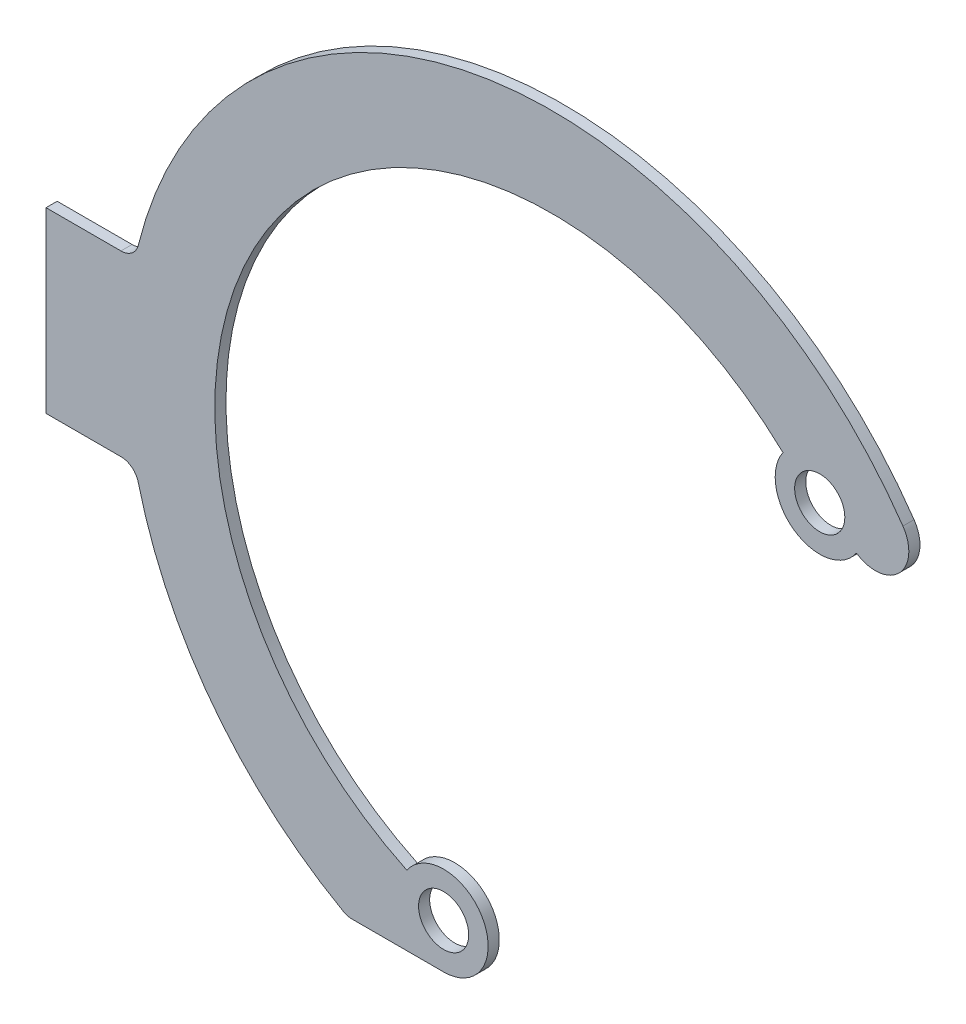
ISO-10303-21;
HEADER;
FILE_DESCRIPTION(('STEP AP214'),'2;1');
FILE_NAME('part.step','',(''),(''),'','','');
FILE_SCHEMA(('AUTOMOTIVE_DESIGN { 1 0 10303 214 1 1 1 1 }'));
ENDSEC;
DATA;
#1=APPLICATION_CONTEXT('core data for automotive mechanical design processes');
#2=APPLICATION_PROTOCOL_DEFINITION('international standard','automotive_design',2000,#1);
#3=PRODUCT_CONTEXT('',#1,'mechanical');
#4=PRODUCT('Part','Part','',(#3));
#5=PRODUCT_RELATED_PRODUCT_CATEGORY('part','',(#4));
#6=PRODUCT_DEFINITION_FORMATION('','',#4);
#7=PRODUCT_DEFINITION_CONTEXT('part definition',#1,'design');
#8=PRODUCT_DEFINITION('design','',#6,#7);
#9=PRODUCT_DEFINITION_SHAPE('','',#8);
#10=(LENGTH_UNIT() NAMED_UNIT(*) SI_UNIT(.MILLI.,.METRE.));
#11=(NAMED_UNIT(*) PLANE_ANGLE_UNIT() SI_UNIT($,.RADIAN.));
#12=(NAMED_UNIT(*) SI_UNIT($,.STERADIAN.) SOLID_ANGLE_UNIT());
#13=UNCERTAINTY_MEASURE_WITH_UNIT(LENGTH_MEASURE(1.E-05),#10,'distance_accuracy_value','');
#14=(GEOMETRIC_REPRESENTATION_CONTEXT(3) GLOBAL_UNCERTAINTY_ASSIGNED_CONTEXT((#13)) GLOBAL_UNIT_ASSIGNED_CONTEXT((#10,
#11,#12)) REPRESENTATION_CONTEXT('',''));
#15=CARTESIAN_POINT('',(0.,0.,0.));
#16=DIRECTION('',(0.,0.,1.));
#17=DIRECTION('',(1.,0.,0.));
#18=AXIS2_PLACEMENT_3D('',#15,#16,#17);
#19=CARTESIAN_POINT('',(0.,-25.4,6.35));
#20=DIRECTION('',(0.,-1.,0.));
#21=DIRECTION('',(1.,0.,0.));
#22=AXIS2_PLACEMENT_3D('',#19,#20,#21);
#23=PLANE('',#22);
#24=DIRECTION('',(-1.,0.,0.));
#25=VECTOR('',#24,1.);
#26=CARTESIAN_POINT('',(0.,-25.4,6.35));
#27=LINE('',#26,#25);
#28=CARTESIAN_POINT('',(0.,-25.4,6.35));
#29=VERTEX_POINT('',#28);
#30=CARTESIAN_POINT('',(-52.1627829426318,-25.4,6.35));
#31=VERTEX_POINT('',#30);
#32=EDGE_CURVE('E135',#29,#31,#27,.T.);
#33=ORIENTED_EDGE('',*,*,#32,.T.);
#34=DIRECTION('',(0.,0.,1.));
#35=VECTOR('',#34,1.);
#36=CARTESIAN_POINT('',(-52.1627829426318,-25.4,0.));
#37=LINE('',#36,#35);
#38=CARTESIAN_POINT('',(-52.1627829426318,-25.4,0.));
#39=VERTEX_POINT('',#38);
#40=EDGE_CURVE('E143',#31,#39,#37,.F.);
#41=ORIENTED_EDGE('',*,*,#40,.T.);
#42=DIRECTION('',(-1.,0.,0.));
#43=VECTOR('',#42,1.);
#44=CARTESIAN_POINT('',(0.,-25.4,0.));
#45=LINE('',#44,#43);
#46=CARTESIAN_POINT('',(0.,-25.4,0.));
#47=VERTEX_POINT('',#46);
#48=EDGE_CURVE('E138',#47,#39,#45,.T.);
#49=ORIENTED_EDGE('',*,*,#48,.F.);
#50=DIRECTION('',(0.,0.,-1.));
#51=VECTOR('',#50,1.);
#52=CARTESIAN_POINT('',(0.,-25.4,6.35));
#53=LINE('',#52,#51);
#54=EDGE_CURVE('E132',#29,#47,#53,.T.);
#55=ORIENTED_EDGE('',*,*,#54,.F.);
#56=EDGE_LOOP('',(#33,#41,#49,#55));
#57=FACE_BOUND('',#56,.T.);
#58=ADVANCED_FACE('F35',(#57),#23,.T.);
#59=CARTESIAN_POINT('',(0.,0.,6.35));
#60=DIRECTION('',(0.,0.,-1.));
#61=DIRECTION('',(-1.,0.,0.));
#62=AXIS2_PLACEMENT_3D('',#59,#60,#61);
#63=CYLINDRICAL_SURFACE('',#62,25.4);
#64=CARTESIAN_POINT('',(0.,0.,0.));
#65=DIRECTION('',(0.,0.,1.));
#66=DIRECTION('',(1.,0.,0.));
#67=AXIS2_PLACEMENT_3D('',#64,#65,#66);
#68=CIRCLE('',#67,25.4);
#69=CARTESIAN_POINT('',(-20.9641804602874,14.340960136215,0.));
#70=VERTEX_POINT('',#69);
#71=EDGE_CURVE('E182',#70,#47,#68,.F.);
#72=ORIENTED_EDGE('',*,*,#71,.F.);
#73=DIRECTION('',(0.,0.,-1.));
#74=VECTOR('',#73,1.);
#75=CARTESIAN_POINT('',(-20.9641804602874,14.340960136215,6.35));
#76=LINE('',#75,#74);
#77=CARTESIAN_POINT('',(-20.9641804602874,14.340960136215,6.35));
#78=VERTEX_POINT('',#77);
#79=EDGE_CURVE('E144',#78,#70,#76,.T.);
#80=ORIENTED_EDGE('',*,*,#79,.F.);
#81=CARTESIAN_POINT('',(0.,0.,6.35));
#82=DIRECTION('',(0.,0.,1.));
#83=DIRECTION('',(1.,0.,0.));
#84=AXIS2_PLACEMENT_3D('',#81,#82,#83);
#85=CIRCLE('',#84,25.4);
#86=EDGE_CURVE('E150',#78,#29,#85,.F.);
#87=ORIENTED_EDGE('',*,*,#86,.T.);
#88=ORIENTED_EDGE('',*,*,#54,.T.);
#89=EDGE_LOOP('',(#72,#80,#87,#88));
#90=FACE_BOUND('',#89,.T.);
#91=ADVANCED_FACE('F155',(#90),#63,.T.);
#92=CARTESIAN_POINT('',(61.7615299678129,187.852179878327,6.35));
#93=DIRECTION('',(0.,0.,-1.));
#94=DIRECTION('',(-1.,0.,0.));
#95=AXIS2_PLACEMENT_3D('',#92,#93,#94);
#96=CYLINDRICAL_SURFACE('',#95,192.22301251991);
#97=CARTESIAN_POINT('',(61.7615299678129,187.852179878327,0.));
#98=DIRECTION('',(0.,0.,1.));
#99=DIRECTION('',(1.,0.,0.));
#100=AXIS2_PLACEMENT_3D('',#97,#98,#99);
#101=CIRCLE('',#100,192.22301251991);
#102=CARTESIAN_POINT('',(193.49166298277,327.840960136215,0.));
#103=VERTEX_POINT('',#102);
#104=EDGE_CURVE('E184',#70,#103,#101,.F.);
#105=ORIENTED_EDGE('',*,*,#104,.T.);
#106=DIRECTION('',(0.,0.,-1.));
#107=VECTOR('',#106,1.);
#108=CARTESIAN_POINT('',(193.49166298277,327.840960136215,6.35));
#109=LINE('',#108,#107);
#110=CARTESIAN_POINT('',(193.49166298277,327.840960136215,6.35));
#111=VERTEX_POINT('',#110);
#112=EDGE_CURVE('E216',#111,#103,#109,.T.);
#113=ORIENTED_EDGE('',*,*,#112,.F.);
#114=CARTESIAN_POINT('',(61.7615299678129,187.852179878327,6.35));
#115=DIRECTION('',(0.,0.,1.));
#116=DIRECTION('',(1.,0.,0.));
#117=AXIS2_PLACEMENT_3D('',#114,#115,#116);
#118=CIRCLE('',#117,192.22301251991);
#119=EDGE_CURVE('E157',#78,#111,#118,.F.);
#120=ORIENTED_EDGE('',*,*,#119,.F.);
#121=ORIENTED_EDGE('',*,*,#79,.T.);
#122=EDGE_LOOP('',(#105,#113,#120,#121));
#123=FACE_BOUND('',#122,.T.);
#124=ADVANCED_FACE('F278',(#123),#96,.F.);
#125=CARTESIAN_POINT('',(214.455843443057,313.5,6.35));
#126=DIRECTION('',(0.,0.,-1.));
#127=DIRECTION('',(-1.,0.,0.));
#128=AXIS2_PLACEMENT_3D('',#125,#126,#127);
#129=CYLINDRICAL_SURFACE('',#128,25.4);
#130=CARTESIAN_POINT('',(214.455843443057,313.5,0.));
#131=DIRECTION('',(0.,0.,1.));
#132=DIRECTION('',(1.,0.,0.));
#133=AXIS2_PLACEMENT_3D('',#130,#131,#132);
#134=CIRCLE('',#133,25.4);
#135=CARTESIAN_POINT('',(235.420023903345,299.159039863785,0.));
#136=VERTEX_POINT('',#135);
#137=EDGE_CURVE('E186',#103,#136,#134,.T.);
#138=ORIENTED_EDGE('',*,*,#137,.T.);
#139=DIRECTION('',(0.,0.,-1.));
#140=VECTOR('',#139,1.);
#141=CARTESIAN_POINT('',(235.420023903345,299.159039863785,6.35));
#142=LINE('',#141,#140);
#143=CARTESIAN_POINT('',(235.420023903345,299.159039863785,6.35));
#144=VERTEX_POINT('',#143);
#145=EDGE_CURVE('E213',#144,#136,#142,.T.);
#146=ORIENTED_EDGE('',*,*,#145,.F.);
#147=CARTESIAN_POINT('',(214.455843443057,313.5,6.35));
#148=DIRECTION('',(0.,0.,1.));
#149=DIRECTION('',(1.,0.,0.));
#150=AXIS2_PLACEMENT_3D('',#147,#148,#149);
#151=CIRCLE('',#150,25.4);
#152=EDGE_CURVE('E159',#111,#144,#151,.T.);
#153=ORIENTED_EDGE('',*,*,#152,.F.);
#154=ORIENTED_EDGE('',*,*,#112,.T.);
#155=EDGE_LOOP('',(#138,#146,#153,#154));
#156=FACE_BOUND('',#155,.T.);
#157=ADVANCED_FACE('F303',(#156),#129,.T.);
#158=CARTESIAN_POINT('',(246.187929872378,314.899988989232,6.35));
#159=DIRECTION('',(0.,0.,-1.));
#160=DIRECTION('',(-1.,0.,0.));
#161=AXIS2_PLACEMENT_3D('',#158,#159,#160);
#162=CYLINDRICAL_SURFACE('',#161,19.071583005295);
#163=CARTESIAN_POINT('',(246.187929872378,314.899988989232,0.));
#164=DIRECTION('',(0.,0.,1.));
#165=DIRECTION('',(1.,0.,0.));
#166=AXIS2_PLACEMENT_3D('',#163,#164,#165);
#167=CIRCLE('',#166,19.071583005295);
#168=CARTESIAN_POINT('',(261.893582664016,325.719311921669,0.));
#169=VERTEX_POINT('',#168);
#170=EDGE_CURVE('E188',#136,#169,#167,.T.);
#171=ORIENTED_EDGE('',*,*,#170,.T.);
#172=DIRECTION('',(0.,0.,-1.));
#173=VECTOR('',#172,1.);
#174=CARTESIAN_POINT('',(261.893582664016,325.719311921669,6.35));
#175=LINE('',#174,#173);
#176=CARTESIAN_POINT('',(261.893582664016,325.719311921669,6.35));
#177=VERTEX_POINT('',#176);
#178=EDGE_CURVE('E210',#177,#169,#175,.T.);
#179=ORIENTED_EDGE('',*,*,#178,.F.);
#180=CARTESIAN_POINT('',(246.187929872378,314.899988989232,6.35));
#181=DIRECTION('',(0.,0.,1.));
#182=DIRECTION('',(1.,0.,0.));
#183=AXIS2_PLACEMENT_3D('',#180,#181,#182);
#184=CIRCLE('',#183,19.071583005295);
#185=EDGE_CURVE('E163',#144,#177,#184,.T.);
#186=ORIENTED_EDGE('',*,*,#185,.F.);
#187=ORIENTED_EDGE('',*,*,#145,.T.);
#188=EDGE_LOOP('',(#171,#179,#186,#187));
#189=FACE_BOUND('',#188,.T.);
#190=ADVANCED_FACE('F307',(#189),#162,.T.);
#191=CARTESIAN_POINT('',(61.7615299678129,187.852179878327,6.35));
#192=DIRECTION('',(0.,0.,-1.));
#193=DIRECTION('',(-1.,0.,0.));
#194=AXIS2_PLACEMENT_3D('',#191,#192,#193);
#195=CYLINDRICAL_SURFACE('',#194,243.02301251991);
#196=CARTESIAN_POINT('',(61.7615299678129,187.852179878327,0.));
#197=DIRECTION('',(0.,0.,1.));
#198=DIRECTION('',(1.,0.,0.));
#199=AXIS2_PLACEMENT_3D('',#196,#197,#198);
#200=CIRCLE('',#199,243.02301251991);
#201=CARTESIAN_POINT('',(-174.112012056583,246.365911489956,0.));
#202=VERTEX_POINT('',#201);
#203=EDGE_CURVE('E190',#169,#202,#200,.T.);
#204=ORIENTED_EDGE('',*,*,#203,.T.);
#205=DIRECTION('',(0.,0.,-1.));
#206=VECTOR('',#205,1.);
#207=CARTESIAN_POINT('',(-174.112012056583,246.365911489956,6.35));
#208=LINE('',#207,#206);
#209=CARTESIAN_POINT('',(-174.112012056583,246.365911489956,6.35));
#210=VERTEX_POINT('',#209);
#211=EDGE_CURVE('E233',#202,#210,#208,.F.);
#212=ORIENTED_EDGE('',*,*,#211,.T.);
#213=CARTESIAN_POINT('',(61.7615299678129,187.852179878327,6.35));
#214=DIRECTION('',(0.,0.,1.));
#215=DIRECTION('',(1.,0.,0.));
#216=AXIS2_PLACEMENT_3D('',#213,#214,#215);
#217=CIRCLE('',#216,243.02301251991);
#218=EDGE_CURVE('E165',#177,#210,#217,.T.);
#219=ORIENTED_EDGE('',*,*,#218,.F.);
#220=ORIENTED_EDGE('',*,*,#178,.T.);
#221=EDGE_LOOP('',(#204,#212,#219,#220));
#222=FACE_BOUND('',#221,.T.);
#223=ADVANCED_FACE('F249',(#222),#195,.T.);
#224=CARTESIAN_POINT('',(0.,238.652179878327,6.35));
#225=DIRECTION('',(0.,1.,0.));
#226=DIRECTION('',(0.,0.,1.));
#227=AXIS2_PLACEMENT_3D('',#224,#225,#226);
#228=PLANE('',#227);
#229=DIRECTION('',(1.,0.,0.));
#230=VECTOR('',#229,1.);
#231=CARTESIAN_POINT('',(0.,238.652179878327,6.35));
#232=LINE('',#231,#230);
#233=CARTESIAN_POINT('',(-226.692724389756,238.652179878327,6.35));
#234=VERTEX_POINT('',#233);
#235=CARTESIAN_POINT('',(-183.973115999452,238.652179878327,6.35));
#236=VERTEX_POINT('',#235);
#237=EDGE_CURVE('E167',#234,#236,#232,.T.);
#238=ORIENTED_EDGE('',*,*,#237,.T.);
#239=DIRECTION('',(0.,0.,-1.));
#240=VECTOR('',#239,1.);
#241=CARTESIAN_POINT('',(-183.973115999452,238.652179878327,6.35));
#242=LINE('',#241,#240);
#243=CARTESIAN_POINT('',(-183.973115999452,238.652179878327,0.));
#244=VERTEX_POINT('',#243);
#245=EDGE_CURVE('E230',#236,#244,#242,.T.);
#246=ORIENTED_EDGE('',*,*,#245,.T.);
#247=DIRECTION('',(1.,0.,0.));
#248=VECTOR('',#247,1.);
#249=CARTESIAN_POINT('',(0.,238.652179878327,0.));
#250=LINE('',#249,#248);
#251=CARTESIAN_POINT('',(-226.692724389756,238.652179878327,0.));
#252=VERTEX_POINT('',#251);
#253=EDGE_CURVE('E193',#252,#244,#250,.T.);
#254=ORIENTED_EDGE('',*,*,#253,.F.);
#255=DIRECTION('',(0.,0.,-1.));
#256=VECTOR('',#255,1.);
#257=CARTESIAN_POINT('',(-226.692724389756,238.652179878327,6.35));
#258=LINE('',#257,#256);
#259=EDGE_CURVE('E208',#234,#252,#258,.T.);
#260=ORIENTED_EDGE('',*,*,#259,.F.);
#261=EDGE_LOOP('',(#238,#246,#254,#260));
#262=FACE_BOUND('',#261,.T.);
#263=ADVANCED_FACE('F253',(#262),#228,.T.);
#264=CARTESIAN_POINT('',(-226.692724389756,0.,6.35));
#265=DIRECTION('',(1.,0.,0.));
#266=DIRECTION('',(0.,0.,-1.));
#267=AXIS2_PLACEMENT_3D('',#264,#265,#266);
#268=PLANE('',#267);
#269=DIRECTION('',(0.,-1.,0.));
#270=VECTOR('',#269,1.);
#271=CARTESIAN_POINT('',(-226.692724389756,0.,0.));
#272=LINE('',#271,#270);
#273=CARTESIAN_POINT('',(-226.692724389756,137.052179878327,0.));
#274=VERTEX_POINT('',#273);
#275=EDGE_CURVE('E197',#252,#274,#272,.T.);
#276=ORIENTED_EDGE('',*,*,#275,.T.);
#277=DIRECTION('',(0.,0.,-1.));
#278=VECTOR('',#277,1.);
#279=CARTESIAN_POINT('',(-226.692724389756,137.052179878327,6.35));
#280=LINE('',#279,#278);
#281=CARTESIAN_POINT('',(-226.692724389756,137.052179878327,6.35));
#282=VERTEX_POINT('',#281);
#283=EDGE_CURVE('E180',#282,#274,#280,.T.);
#284=ORIENTED_EDGE('',*,*,#283,.F.);
#285=DIRECTION('',(0.,-1.,0.));
#286=VECTOR('',#285,1.);
#287=CARTESIAN_POINT('',(-226.692724389756,0.,6.35));
#288=LINE('',#287,#286);
#289=EDGE_CURVE('E170',#234,#282,#288,.T.);
#290=ORIENTED_EDGE('',*,*,#289,.F.);
#291=ORIENTED_EDGE('',*,*,#259,.T.);
#292=EDGE_LOOP('',(#276,#284,#290,#291));
#293=FACE_BOUND('',#292,.T.);
#294=ADVANCED_FACE('F258',(#293),#268,.F.);
#295=CARTESIAN_POINT('',(0.,137.052179878327,6.35));
#296=DIRECTION('',(0.,1.,0.));
#297=DIRECTION('',(0.,0.,1.));
#298=AXIS2_PLACEMENT_3D('',#295,#296,#297);
#299=PLANE('',#298);
#300=DIRECTION('',(1.,0.,0.));
#301=VECTOR('',#300,1.);
#302=CARTESIAN_POINT('',(0.,137.052179878327,0.));
#303=LINE('',#302,#301);
#304=CARTESIAN_POINT('',(-183.973115999452,137.052179878327,0.));
#305=VERTEX_POINT('',#304);
#306=EDGE_CURVE('E199',#274,#305,#303,.T.);
#307=ORIENTED_EDGE('',*,*,#306,.T.);
#308=DIRECTION('',(0.,0.,1.));
#309=VECTOR('',#308,1.);
#310=CARTESIAN_POINT('',(-183.973115999452,137.052179878327,6.35));
#311=LINE('',#310,#309);
#312=CARTESIAN_POINT('',(-183.973115999452,137.052179878327,6.35));
#313=VERTEX_POINT('',#312);
#314=EDGE_CURVE('E50',#305,#313,#311,.T.);
#315=ORIENTED_EDGE('',*,*,#314,.T.);
#316=DIRECTION('',(1.,0.,0.));
#317=VECTOR('',#316,1.);
#318=CARTESIAN_POINT('',(0.,137.052179878327,6.35));
#319=LINE('',#318,#317);
#320=EDGE_CURVE('E172',#282,#313,#319,.T.);
#321=ORIENTED_EDGE('',*,*,#320,.F.);
#322=ORIENTED_EDGE('',*,*,#283,.T.);
#323=EDGE_LOOP('',(#307,#315,#321,#322));
#324=FACE_BOUND('',#323,.T.);
#325=ADVANCED_FACE('F260',(#324),#299,.F.);
#326=CARTESIAN_POINT('',(214.455843443057,313.5,6.35));
#327=DIRECTION('',(0.,0.,-1.));
#328=DIRECTION('',(-1.,0.,0.));
#329=AXIS2_PLACEMENT_3D('',#326,#327,#328);
#330=CYLINDRICAL_SURFACE('',#329,14.3002);
#331=CARTESIAN_POINT('',(214.455843443057,313.5,6.35));
#332=DIRECTION('',(0.,0.,1.));
#333=DIRECTION('',(1.,0.,0.));
#334=AXIS2_PLACEMENT_3D('',#331,#332,#333);
#335=CIRCLE('',#334,14.3002);
#336=CARTESIAN_POINT('',(228.756043443057,313.5,6.35));
#337=VERTEX_POINT('',#336);
#338=EDGE_CURVE('E174',#337,#337,#335,.T.);
#339=ORIENTED_EDGE('',*,*,#338,.T.);
#340=EDGE_LOOP('',(#339));
#341=FACE_BOUND('',#340,.T.);
#342=CARTESIAN_POINT('',(214.455843443057,313.5,0.));
#343=DIRECTION('',(0.,0.,1.));
#344=DIRECTION('',(1.,0.,0.));
#345=AXIS2_PLACEMENT_3D('',#342,#343,#344);
#346=CIRCLE('',#345,14.3002);
#347=CARTESIAN_POINT('',(228.756043443057,313.5,0.));
#348=VERTEX_POINT('',#347);
#349=EDGE_CURVE('E201',#348,#348,#346,.T.);
#350=ORIENTED_EDGE('',*,*,#349,.F.);
#351=EDGE_LOOP('',(#350));
#352=FACE_BOUND('',#351,.T.);
#353=ADVANCED_FACE('F262',(#341,#352),#330,.F.);
#354=CARTESIAN_POINT('',(-174.112012056583,129.338448266698,0.));
#355=VERTEX_POINT('',#354);
#356=CARTESIAN_POINT('',(-57.1333920859415,-24.1010746946658,0.));
#357=VERTEX_POINT('',#356);
#358=EDGE_CURVE('E194',#355,#357,#200,.T.);
#359=ORIENTED_EDGE('',*,*,#358,.T.);
#360=DIRECTION('',(0.,0.,-1.));
#361=VECTOR('',#360,1.);
#362=CARTESIAN_POINT('',(-57.1333920859415,-24.1010746946658,6.35));
#363=LINE('',#362,#361);
#364=CARTESIAN_POINT('',(-57.1333920859415,-24.1010746946658,6.35));
#365=VERTEX_POINT('',#364);
#366=EDGE_CURVE('E226',#357,#365,#363,.F.);
#367=ORIENTED_EDGE('',*,*,#366,.T.);
#368=CARTESIAN_POINT('',(-174.112012056583,129.338448266698,6.35));
#369=VERTEX_POINT('',#368);
#370=EDGE_CURVE('E168',#369,#365,#217,.T.);
#371=ORIENTED_EDGE('',*,*,#370,.F.);
#372=DIRECTION('',(0.,0.,-1.));
#373=VECTOR('',#372,1.);
#374=CARTESIAN_POINT('',(-174.112012056583,129.338448266698,6.35));
#375=LINE('',#374,#373);
#376=EDGE_CURVE('E223',#369,#355,#375,.T.);
#377=ORIENTED_EDGE('',*,*,#376,.T.);
#378=EDGE_LOOP('',(#359,#367,#371,#377));
#379=FACE_BOUND('',#378,.T.);
#380=ADVANCED_FACE('F268',(#379),#195,.T.);
#381=CARTESIAN_POINT('',(0.,0.,6.35));
#382=DIRECTION('',(0.,0.,-1.));
#383=DIRECTION('',(-1.,0.,0.));
#384=AXIS2_PLACEMENT_3D('',#381,#382,#383);
#385=CYLINDRICAL_SURFACE('',#384,14.3002000000001);
#386=CARTESIAN_POINT('',(0.,0.,6.35));
#387=DIRECTION('',(0.,0.,1.));
#388=DIRECTION('',(1.,0.,0.));
#389=AXIS2_PLACEMENT_3D('',#386,#387,#388);
#390=CIRCLE('',#389,14.3002000000001);
#391=CARTESIAN_POINT('',(14.3002000000001,0.,6.35));
#392=VERTEX_POINT('',#391);
#393=EDGE_CURVE('E177',#392,#392,#390,.F.);
#394=ORIENTED_EDGE('',*,*,#393,.F.);
#395=EDGE_LOOP('',(#394));
#396=FACE_BOUND('',#395,.T.);
#397=CARTESIAN_POINT('',(0.,0.,0.));
#398=DIRECTION('',(0.,0.,1.));
#399=DIRECTION('',(1.,0.,0.));
#400=AXIS2_PLACEMENT_3D('',#397,#398,#399);
#401=CIRCLE('',#400,14.3002000000001);
#402=CARTESIAN_POINT('',(14.3002000000001,0.,0.));
#403=VERTEX_POINT('',#402);
#404=EDGE_CURVE('E153',#403,#403,#401,.F.);
#405=ORIENTED_EDGE('',*,*,#404,.T.);
#406=EDGE_LOOP('',(#405));
#407=FACE_BOUND('',#406,.T.);
#408=ADVANCED_FACE('F352',(#396,#407),#385,.F.);
#409=CARTESIAN_POINT('',(0.,0.,6.35));
#410=DIRECTION('',(0.,0.,1.));
#411=DIRECTION('',(1.,0.,0.));
#412=AXIS2_PLACEMENT_3D('',#409,#410,#411);
#413=PLANE('',#412);
#414=ORIENTED_EDGE('',*,*,#370,.T.);
#415=CARTESIAN_POINT('',(-52.1627829426318,-15.24,6.35));
#416=DIRECTION('',(0.,0.,1.));
#417=DIRECTION('',(1.,0.,0.));
#418=AXIS2_PLACEMENT_3D('',#415,#416,#417);
#419=CIRCLE('',#418,10.16);
#420=EDGE_CURVE('E152',#365,#31,#419,.T.);
#421=ORIENTED_EDGE('',*,*,#420,.T.);
#422=ORIENTED_EDGE('',*,*,#32,.F.);
#423=ORIENTED_EDGE('',*,*,#86,.F.);
#424=ORIENTED_EDGE('',*,*,#119,.T.);
#425=ORIENTED_EDGE('',*,*,#152,.T.);
#426=ORIENTED_EDGE('',*,*,#185,.T.);
#427=ORIENTED_EDGE('',*,*,#218,.T.);
#428=CARTESIAN_POINT('',(-183.973115999452,248.812179878327,6.35));
#429=DIRECTION('',(0.,0.,1.));
#430=DIRECTION('',(1.,0.,0.));
#431=AXIS2_PLACEMENT_3D('',#428,#429,#430);
#432=CIRCLE('',#431,10.16);
#433=EDGE_CURVE('E11',#210,#236,#432,.F.);
#434=ORIENTED_EDGE('',*,*,#433,.T.);
#435=ORIENTED_EDGE('',*,*,#237,.F.);
#436=ORIENTED_EDGE('',*,*,#289,.T.);
#437=ORIENTED_EDGE('',*,*,#320,.T.);
#438=CARTESIAN_POINT('',(-183.973115999452,126.892179878327,6.35));
#439=DIRECTION('',(0.,0.,1.));
#440=DIRECTION('',(1.,0.,0.));
#441=AXIS2_PLACEMENT_3D('',#438,#439,#440);
#442=CIRCLE('',#441,10.16);
#443=EDGE_CURVE('E237',#313,#369,#442,.F.);
#444=ORIENTED_EDGE('',*,*,#443,.T.);
#445=EDGE_LOOP('',(#414,#421,#422,#423,#424,#425,#426,#427,#434,#435,#436,#437,#444));
#446=FACE_BOUND('',#445,.T.);
#447=ORIENTED_EDGE('',*,*,#338,.F.);
#448=EDGE_LOOP('',(#447));
#449=FACE_BOUND('',#448,.T.);
#450=ORIENTED_EDGE('',*,*,#393,.T.);
#451=EDGE_LOOP('',(#450));
#452=FACE_BOUND('',#451,.T.);
#453=ADVANCED_FACE('F148',(#446,#449,#452),#413,.T.);
#454=CARTESIAN_POINT('',(0.,0.,0.));
#455=DIRECTION('',(0.,0.,1.));
#456=DIRECTION('',(1.,0.,0.));
#457=AXIS2_PLACEMENT_3D('',#454,#455,#456);
#458=PLANE('',#457);
#459=ORIENTED_EDGE('',*,*,#48,.T.);
#460=CARTESIAN_POINT('',(-52.1627829426318,-15.24,0.));
#461=DIRECTION('',(0.,0.,1.));
#462=DIRECTION('',(1.,0.,0.));
#463=AXIS2_PLACEMENT_3D('',#460,#461,#462);
#464=CIRCLE('',#463,10.16);
#465=EDGE_CURVE('E221',#39,#357,#464,.F.);
#466=ORIENTED_EDGE('',*,*,#465,.T.);
#467=ORIENTED_EDGE('',*,*,#358,.F.);
#468=CARTESIAN_POINT('',(-183.973115999452,126.892179878327,0.));
#469=DIRECTION('',(0.,0.,1.));
#470=DIRECTION('',(1.,0.,0.));
#471=AXIS2_PLACEMENT_3D('',#468,#469,#470);
#472=CIRCLE('',#471,10.16);
#473=EDGE_CURVE('E235',#355,#305,#472,.T.);
#474=ORIENTED_EDGE('',*,*,#473,.T.);
#475=ORIENTED_EDGE('',*,*,#306,.F.);
#476=ORIENTED_EDGE('',*,*,#275,.F.);
#477=ORIENTED_EDGE('',*,*,#253,.T.);
#478=CARTESIAN_POINT('',(-183.973115999452,248.812179878327,0.));
#479=DIRECTION('',(0.,0.,1.));
#480=DIRECTION('',(1.,0.,0.));
#481=AXIS2_PLACEMENT_3D('',#478,#479,#480);
#482=CIRCLE('',#481,10.16);
#483=EDGE_CURVE('E43',#244,#202,#482,.T.);
#484=ORIENTED_EDGE('',*,*,#483,.T.);
#485=ORIENTED_EDGE('',*,*,#203,.F.);
#486=ORIENTED_EDGE('',*,*,#170,.F.);
#487=ORIENTED_EDGE('',*,*,#137,.F.);
#488=ORIENTED_EDGE('',*,*,#104,.F.);
#489=ORIENTED_EDGE('',*,*,#71,.T.);
#490=EDGE_LOOP('',(#459,#466,#467,#474,#475,#476,#477,#484,#485,#486,#487,#488,#489));
#491=FACE_BOUND('',#490,.T.);
#492=ORIENTED_EDGE('',*,*,#349,.T.);
#493=EDGE_LOOP('',(#492));
#494=FACE_BOUND('',#493,.T.);
#495=ORIENTED_EDGE('',*,*,#404,.F.);
#496=EDGE_LOOP('',(#495));
#497=FACE_BOUND('',#496,.T.);
#498=ADVANCED_FACE('F240',(#491,#494,#497),#458,.F.);
#499=CARTESIAN_POINT('',(-52.1627829426318,-15.24,6.35));
#500=DIRECTION('',(0.,0.,-1.));
#501=DIRECTION('',(-1.,0.,0.));
#502=AXIS2_PLACEMENT_3D('',#499,#500,#501);
#503=CYLINDRICAL_SURFACE('',#502,10.16);
#504=ORIENTED_EDGE('',*,*,#420,.F.);
#505=ORIENTED_EDGE('',*,*,#366,.F.);
#506=ORIENTED_EDGE('',*,*,#465,.F.);
#507=ORIENTED_EDGE('',*,*,#40,.F.);
#508=EDGE_LOOP('',(#504,#505,#506,#507));
#509=FACE_BOUND('',#508,.T.);
#510=ADVANCED_FACE('F282',(#509),#503,.T.);
#511=CARTESIAN_POINT('',(-183.973115999452,126.892179878327,6.35));
#512=DIRECTION('',(0.,0.,-1.));
#513=DIRECTION('',(-1.,0.,0.));
#514=AXIS2_PLACEMENT_3D('',#511,#512,#513);
#515=CYLINDRICAL_SURFACE('',#514,10.16);
#516=ORIENTED_EDGE('',*,*,#443,.F.);
#517=ORIENTED_EDGE('',*,*,#314,.F.);
#518=ORIENTED_EDGE('',*,*,#473,.F.);
#519=ORIENTED_EDGE('',*,*,#376,.F.);
#520=EDGE_LOOP('',(#516,#517,#518,#519));
#521=FACE_BOUND('',#520,.T.);
#522=ADVANCED_FACE('F284',(#521),#515,.F.);
#523=CARTESIAN_POINT('',(-183.973115999452,248.812179878327,6.35));
#524=DIRECTION('',(0.,0.,-1.));
#525=DIRECTION('',(-1.,0.,0.));
#526=AXIS2_PLACEMENT_3D('',#523,#524,#525);
#527=CYLINDRICAL_SURFACE('',#526,10.16);
#528=ORIENTED_EDGE('',*,*,#433,.F.);
#529=ORIENTED_EDGE('',*,*,#211,.F.);
#530=ORIENTED_EDGE('',*,*,#483,.F.);
#531=ORIENTED_EDGE('',*,*,#245,.F.);
#532=EDGE_LOOP('',(#528,#529,#530,#531));
#533=FACE_BOUND('',#532,.T.);
#534=ADVANCED_FACE('F37',(#533),#527,.F.);
#535=CLOSED_SHELL('',(#58,#91,#124,#157,#190,#223,#263,#294,#325,#353,#380,#408,#453,#498,#510,
#522,#534));
#536=MANIFOLD_SOLID_BREP('B2',#535);
#537=ADVANCED_BREP_SHAPE_REPRESENTATION('',(#18,#536),#14);
#538=SHAPE_DEFINITION_REPRESENTATION(#9,#537);
ENDSEC;
END-ISO-10303-21;
